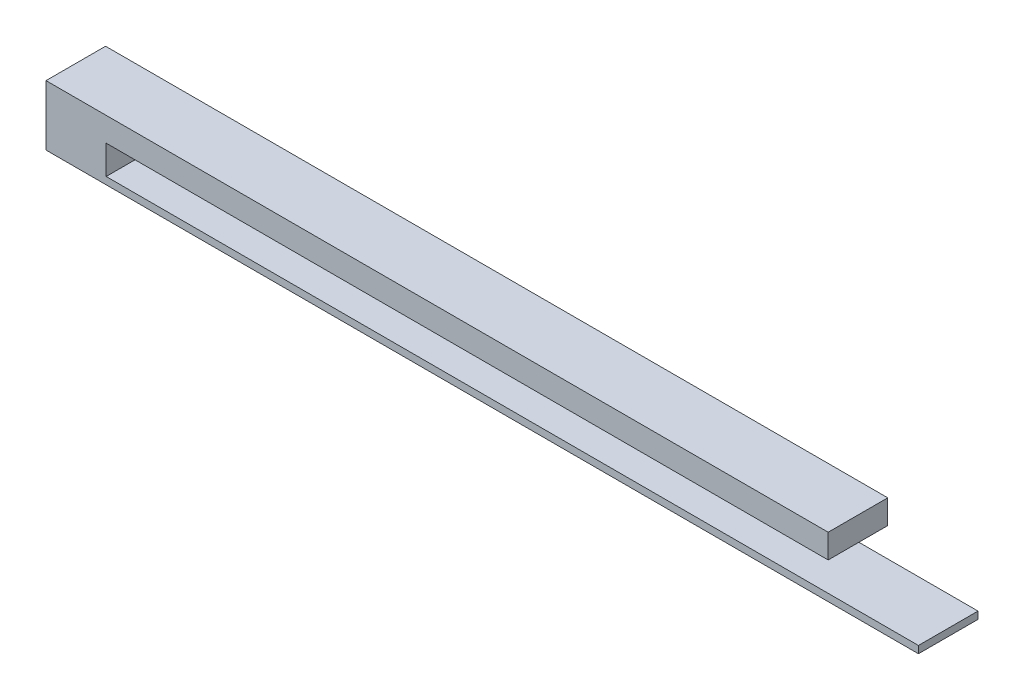
ISO-10303-21;
HEADER;
FILE_DESCRIPTION(('STEP AP214'),'2;1');
FILE_NAME('part.step','',(''),(''),'','','');
FILE_SCHEMA(('AUTOMOTIVE_DESIGN { 1 0 10303 214 1 1 1 1 }'));
ENDSEC;
DATA;
#1=APPLICATION_CONTEXT('core data for automotive mechanical design processes');
#2=APPLICATION_PROTOCOL_DEFINITION('international standard','automotive_design',2000,#1);
#3=PRODUCT_CONTEXT('',#1,'mechanical');
#4=PRODUCT('Part','Part','',(#3));
#5=PRODUCT_RELATED_PRODUCT_CATEGORY('part','',(#4));
#6=PRODUCT_DEFINITION_FORMATION('','',#4);
#7=PRODUCT_DEFINITION_CONTEXT('part definition',#1,'design');
#8=PRODUCT_DEFINITION('design','',#6,#7);
#9=PRODUCT_DEFINITION_SHAPE('','',#8);
#10=(LENGTH_UNIT() NAMED_UNIT(*) SI_UNIT(.MILLI.,.METRE.));
#11=(NAMED_UNIT(*) PLANE_ANGLE_UNIT() SI_UNIT($,.RADIAN.));
#12=(NAMED_UNIT(*) SI_UNIT($,.STERADIAN.) SOLID_ANGLE_UNIT());
#13=UNCERTAINTY_MEASURE_WITH_UNIT(LENGTH_MEASURE(1.E-05),#10,'distance_accuracy_value','');
#14=(GEOMETRIC_REPRESENTATION_CONTEXT(3) GLOBAL_UNCERTAINTY_ASSIGNED_CONTEXT((#13)) GLOBAL_UNIT_ASSIGNED_CONTEXT((#10,
#11,#12)) REPRESENTATION_CONTEXT('',''));
#15=CARTESIAN_POINT('',(0.,0.,0.));
#16=DIRECTION('',(0.,0.,1.));
#17=DIRECTION('',(1.,0.,0.));
#18=AXIS2_PLACEMENT_3D('',#15,#16,#17);
#19=CARTESIAN_POINT('',(-72.5,10.,-4.95));
#20=DIRECTION('',(0.,0.,1.));
#21=DIRECTION('',(1.,0.,0.));
#22=AXIS2_PLACEMENT_3D('',#19,#20,#21);
#23=PLANE('',#22);
#24=DIRECTION('',(0.,1.,0.));
#25=VECTOR('',#24,1.);
#26=CARTESIAN_POINT('',(57.5,10.,-4.95));
#27=LINE('',#26,#25);
#28=CARTESIAN_POINT('',(57.5,6.,-4.95));
#29=VERTEX_POINT('',#28);
#30=CARTESIAN_POINT('',(57.5,10.,-4.95));
#31=VERTEX_POINT('',#30);
#32=EDGE_CURVE('E102',#29,#31,#27,.T.);
#33=ORIENTED_EDGE('',*,*,#32,.F.);
#34=DIRECTION('',(-1.,0.,0.));
#35=VECTOR('',#34,1.);
#36=CARTESIAN_POINT('',(-72.5,6.,-4.95));
#37=LINE('',#36,#35);
#38=CARTESIAN_POINT('',(-62.5,6.,-4.95));
#39=VERTEX_POINT('',#38);
#40=EDGE_CURVE('E110',#29,#39,#37,.T.);
#41=ORIENTED_EDGE('',*,*,#40,.T.);
#42=DIRECTION('',(0.,1.,0.));
#43=VECTOR('',#42,1.);
#44=CARTESIAN_POINT('',(-62.5,10.,-4.95));
#45=LINE('',#44,#43);
#46=CARTESIAN_POINT('',(-62.5,1.2,-4.95));
#47=VERTEX_POINT('',#46);
#48=EDGE_CURVE('E117',#47,#39,#45,.T.);
#49=ORIENTED_EDGE('',*,*,#48,.F.);
#50=DIRECTION('',(1.,0.,0.));
#51=VECTOR('',#50,1.);
#52=CARTESIAN_POINT('',(-72.5,1.2,-4.95));
#53=LINE('',#52,#51);
#54=CARTESIAN_POINT('',(72.5,1.2,-4.95));
#55=VERTEX_POINT('',#54);
#56=EDGE_CURVE('E116',#47,#55,#53,.T.);
#57=ORIENTED_EDGE('',*,*,#56,.T.);
#58=DIRECTION('',(0.,-1.,0.));
#59=VECTOR('',#58,1.);
#60=CARTESIAN_POINT('',(72.5,10.,-4.95));
#61=LINE('',#60,#59);
#62=CARTESIAN_POINT('',(72.5,0.,-4.95));
#63=VERTEX_POINT('',#62);
#64=EDGE_CURVE('E148',#55,#63,#61,.T.);
#65=ORIENTED_EDGE('',*,*,#64,.T.);
#66=DIRECTION('',(-1.,0.,0.));
#67=VECTOR('',#66,1.);
#68=CARTESIAN_POINT('',(-72.5,0.,-4.95));
#69=LINE('',#68,#67);
#70=CARTESIAN_POINT('',(-72.5,0.,-4.95));
#71=VERTEX_POINT('',#70);
#72=EDGE_CURVE('E135',#63,#71,#69,.T.);
#73=ORIENTED_EDGE('',*,*,#72,.T.);
#74=DIRECTION('',(0.,-1.,0.));
#75=VECTOR('',#74,1.);
#76=CARTESIAN_POINT('',(-72.5,10.,-4.95));
#77=LINE('',#76,#75);
#78=CARTESIAN_POINT('',(-72.5,10.,-4.95));
#79=VERTEX_POINT('',#78);
#80=EDGE_CURVE('E145',#79,#71,#77,.T.);
#81=ORIENTED_EDGE('',*,*,#80,.F.);
#82=DIRECTION('',(-1.,0.,0.));
#83=VECTOR('',#82,1.);
#84=CARTESIAN_POINT('',(-72.5,10.,-4.95));
#85=LINE('',#84,#83);
#86=EDGE_CURVE('E112',#31,#79,#85,.T.);
#87=ORIENTED_EDGE('',*,*,#86,.F.);
#88=EDGE_LOOP('',(#33,#41,#49,#57,#65,#73,#81,#87));
#89=FACE_BOUND('',#88,.T.);
#90=ADVANCED_FACE('F38',(#89),#23,.F.);
#91=CARTESIAN_POINT('',(-72.5,10.,4.95));
#92=DIRECTION('',(0.,0.,-1.));
#93=DIRECTION('',(-1.,0.,0.));
#94=AXIS2_PLACEMENT_3D('',#91,#92,#93);
#95=PLANE('',#94);
#96=DIRECTION('',(0.,-1.,0.));
#97=VECTOR('',#96,1.);
#98=CARTESIAN_POINT('',(57.5,10.,4.95));
#99=LINE('',#98,#97);
#100=CARTESIAN_POINT('',(57.5,10.,4.95));
#101=VERTEX_POINT('',#100);
#102=CARTESIAN_POINT('',(57.5,6.,4.95));
#103=VERTEX_POINT('',#102);
#104=EDGE_CURVE('E52',#101,#103,#99,.T.);
#105=ORIENTED_EDGE('',*,*,#104,.F.);
#106=DIRECTION('',(1.,0.,0.));
#107=VECTOR('',#106,1.);
#108=CARTESIAN_POINT('',(-72.5,10.,4.95));
#109=LINE('',#108,#107);
#110=CARTESIAN_POINT('',(-72.5,10.,4.95));
#111=VERTEX_POINT('',#110);
#112=EDGE_CURVE('E129',#111,#101,#109,.T.);
#113=ORIENTED_EDGE('',*,*,#112,.F.);
#114=DIRECTION('',(0.,-1.,0.));
#115=VECTOR('',#114,1.);
#116=CARTESIAN_POINT('',(-72.5,10.,4.95));
#117=LINE('',#116,#115);
#118=CARTESIAN_POINT('',(-72.5,0.,4.95));
#119=VERTEX_POINT('',#118);
#120=EDGE_CURVE('E142',#111,#119,#117,.T.);
#121=ORIENTED_EDGE('',*,*,#120,.T.);
#122=DIRECTION('',(1.,0.,0.));
#123=VECTOR('',#122,1.);
#124=CARTESIAN_POINT('',(-72.5,0.,4.95));
#125=LINE('',#124,#123);
#126=CARTESIAN_POINT('',(72.5,0.,4.95));
#127=VERTEX_POINT('',#126);
#128=EDGE_CURVE('E127',#119,#127,#125,.T.);
#129=ORIENTED_EDGE('',*,*,#128,.T.);
#130=DIRECTION('',(0.,-1.,0.));
#131=VECTOR('',#130,1.);
#132=CARTESIAN_POINT('',(72.5,10.,4.95));
#133=LINE('',#132,#131);
#134=CARTESIAN_POINT('',(72.5,1.2,4.95));
#135=VERTEX_POINT('',#134);
#136=EDGE_CURVE('E132',#135,#127,#133,.T.);
#137=ORIENTED_EDGE('',*,*,#136,.F.);
#138=DIRECTION('',(-1.,0.,0.));
#139=VECTOR('',#138,1.);
#140=CARTESIAN_POINT('',(-72.5,1.2,4.95));
#141=LINE('',#140,#139);
#142=CARTESIAN_POINT('',(-62.5,1.2,4.95));
#143=VERTEX_POINT('',#142);
#144=EDGE_CURVE('E46',#135,#143,#141,.T.);
#145=ORIENTED_EDGE('',*,*,#144,.T.);
#146=DIRECTION('',(0.,-1.,0.));
#147=VECTOR('',#146,1.);
#148=CARTESIAN_POINT('',(-62.5,10.,4.95));
#149=LINE('',#148,#147);
#150=CARTESIAN_POINT('',(-62.5,6.,4.95));
#151=VERTEX_POINT('',#150);
#152=EDGE_CURVE('E150',#151,#143,#149,.T.);
#153=ORIENTED_EDGE('',*,*,#152,.F.);
#154=DIRECTION('',(1.,0.,0.));
#155=VECTOR('',#154,1.);
#156=CARTESIAN_POINT('',(-72.5,6.,4.95));
#157=LINE('',#156,#155);
#158=EDGE_CURVE('E152',#151,#103,#157,.T.);
#159=ORIENTED_EDGE('',*,*,#158,.T.);
#160=EDGE_LOOP('',(#105,#113,#121,#129,#137,#145,#153,#159));
#161=FACE_BOUND('',#160,.T.);
#162=ADVANCED_FACE('F157',(#161),#95,.F.);
#163=CARTESIAN_POINT('',(0.,10.,0.));
#164=DIRECTION('',(0.,1.,0.));
#165=DIRECTION('',(0.,0.,1.));
#166=AXIS2_PLACEMENT_3D('',#163,#164,#165);
#167=PLANE('',#166);
#168=ORIENTED_EDGE('',*,*,#112,.T.);
#169=DIRECTION('',(0.,0.,-1.));
#170=VECTOR('',#169,1.);
#171=CARTESIAN_POINT('',(57.5,10.,0.));
#172=LINE('',#171,#170);
#173=EDGE_CURVE('E113',#101,#31,#172,.T.);
#174=ORIENTED_EDGE('',*,*,#173,.T.);
#175=ORIENTED_EDGE('',*,*,#86,.T.);
#176=DIRECTION('',(0.,0.,1.));
#177=VECTOR('',#176,1.);
#178=CARTESIAN_POINT('',(-72.5,10.,-4.95));
#179=LINE('',#178,#177);
#180=EDGE_CURVE('E126',#79,#111,#179,.T.);
#181=ORIENTED_EDGE('',*,*,#180,.T.);
#182=EDGE_LOOP('',(#168,#174,#175,#181));
#183=FACE_BOUND('',#182,.T.);
#184=ADVANCED_FACE('F172',(#183),#167,.T.);
#185=CARTESIAN_POINT('',(-88.4170976861619,6.,7.58804979475656));
#186=DIRECTION('',(0.,1.,0.));
#187=DIRECTION('',(0.,0.,1.));
#188=AXIS2_PLACEMENT_3D('',#185,#186,#187);
#189=PLANE('',#188);
#190=DIRECTION('',(0.,0.,-1.));
#191=VECTOR('',#190,1.);
#192=CARTESIAN_POINT('',(57.5,6.,7.58804979475656));
#193=LINE('',#192,#191);
#194=EDGE_CURVE('E12',#103,#29,#193,.T.);
#195=ORIENTED_EDGE('',*,*,#194,.F.);
#196=ORIENTED_EDGE('',*,*,#158,.F.);
#197=DIRECTION('',(0.,0.,-1.));
#198=VECTOR('',#197,1.);
#199=CARTESIAN_POINT('',(-62.5,6.,7.58804979475656));
#200=LINE('',#199,#198);
#201=EDGE_CURVE('E60',#151,#39,#200,.T.);
#202=ORIENTED_EDGE('',*,*,#201,.T.);
#203=ORIENTED_EDGE('',*,*,#40,.F.);
#204=EDGE_LOOP('',(#195,#196,#202,#203));
#205=FACE_BOUND('',#204,.T.);
#206=ADVANCED_FACE('F115',(#205),#189,.F.);
#207=CARTESIAN_POINT('',(72.5,10.,-4.95));
#208=DIRECTION('',(-1.,0.,0.));
#209=DIRECTION('',(0.,0.,1.));
#210=AXIS2_PLACEMENT_3D('',#207,#208,#209);
#211=PLANE('',#210);
#212=ORIENTED_EDGE('',*,*,#64,.F.);
#213=DIRECTION('',(0.,0.,-1.));
#214=VECTOR('',#213,1.);
#215=CARTESIAN_POINT('',(72.5,1.2,7.58804979475656));
#216=LINE('',#215,#214);
#217=EDGE_CURVE('E162',#135,#55,#216,.T.);
#218=ORIENTED_EDGE('',*,*,#217,.F.);
#219=ORIENTED_EDGE('',*,*,#136,.T.);
#220=DIRECTION('',(0.,0.,-1.));
#221=VECTOR('',#220,1.);
#222=CARTESIAN_POINT('',(72.5,0.,-4.95));
#223=LINE('',#222,#221);
#224=EDGE_CURVE('E120',#127,#63,#223,.T.);
#225=ORIENTED_EDGE('',*,*,#224,.T.);
#226=EDGE_LOOP('',(#212,#218,#219,#225));
#227=FACE_BOUND('',#226,.T.);
#228=ADVANCED_FACE('F40',(#227),#211,.F.);
#229=CARTESIAN_POINT('',(-72.5,10.,-4.95));
#230=DIRECTION('',(1.,0.,0.));
#231=DIRECTION('',(0.,0.,-1.));
#232=AXIS2_PLACEMENT_3D('',#229,#230,#231);
#233=PLANE('',#232);
#234=DIRECTION('',(0.,0.,1.));
#235=VECTOR('',#234,1.);
#236=CARTESIAN_POINT('',(-72.5,0.,-4.95));
#237=LINE('',#236,#235);
#238=EDGE_CURVE('E137',#71,#119,#237,.T.);
#239=ORIENTED_EDGE('',*,*,#238,.T.);
#240=ORIENTED_EDGE('',*,*,#120,.F.);
#241=ORIENTED_EDGE('',*,*,#180,.F.);
#242=ORIENTED_EDGE('',*,*,#80,.T.);
#243=EDGE_LOOP('',(#239,#240,#241,#242));
#244=FACE_BOUND('',#243,.T.);
#245=ADVANCED_FACE('F183',(#244),#233,.F.);
#246=CARTESIAN_POINT('',(0.,0.,0.));
#247=DIRECTION('',(0.,1.,0.));
#248=DIRECTION('',(0.,0.,1.));
#249=AXIS2_PLACEMENT_3D('',#246,#247,#248);
#250=PLANE('',#249);
#251=ORIENTED_EDGE('',*,*,#224,.F.);
#252=ORIENTED_EDGE('',*,*,#128,.F.);
#253=ORIENTED_EDGE('',*,*,#238,.F.);
#254=ORIENTED_EDGE('',*,*,#72,.F.);
#255=EDGE_LOOP('',(#251,#252,#253,#254));
#256=FACE_BOUND('',#255,.T.);
#257=ADVANCED_FACE('F181',(#256),#250,.F.);
#258=CARTESIAN_POINT('',(-88.4170976861619,1.2,7.58804979475656));
#259=DIRECTION('',(0.,-1.,0.));
#260=DIRECTION('',(0.,0.,-1.));
#261=AXIS2_PLACEMENT_3D('',#258,#259,#260);
#262=PLANE('',#261);
#263=DIRECTION('',(0.,0.,1.));
#264=VECTOR('',#263,1.);
#265=CARTESIAN_POINT('',(-62.5,1.2,7.58804979475656));
#266=LINE('',#265,#264);
#267=EDGE_CURVE('E164',#47,#143,#266,.T.);
#268=ORIENTED_EDGE('',*,*,#267,.T.);
#269=ORIENTED_EDGE('',*,*,#144,.F.);
#270=ORIENTED_EDGE('',*,*,#217,.T.);
#271=ORIENTED_EDGE('',*,*,#56,.F.);
#272=EDGE_LOOP('',(#268,#269,#270,#271));
#273=FACE_BOUND('',#272,.T.);
#274=ADVANCED_FACE('F161',(#273),#262,.F.);
#275=CARTESIAN_POINT('',(-62.5,10.,-4.95));
#276=DIRECTION('',(1.,0.,0.));
#277=DIRECTION('',(0.,0.,-1.));
#278=AXIS2_PLACEMENT_3D('',#275,#276,#277);
#279=PLANE('',#278);
#280=ORIENTED_EDGE('',*,*,#48,.T.);
#281=ORIENTED_EDGE('',*,*,#201,.F.);
#282=ORIENTED_EDGE('',*,*,#152,.T.);
#283=ORIENTED_EDGE('',*,*,#267,.F.);
#284=EDGE_LOOP('',(#280,#281,#282,#283));
#285=FACE_BOUND('',#284,.T.);
#286=ADVANCED_FACE('F205',(#285),#279,.T.);
#287=CARTESIAN_POINT('',(57.5,0.,0.));
#288=DIRECTION('',(1.,0.,0.));
#289=DIRECTION('',(0.,0.,-1.));
#290=AXIS2_PLACEMENT_3D('',#287,#288,#289);
#291=PLANE('',#290);
#292=ORIENTED_EDGE('',*,*,#104,.T.);
#293=ORIENTED_EDGE('',*,*,#194,.T.);
#294=ORIENTED_EDGE('',*,*,#32,.T.);
#295=ORIENTED_EDGE('',*,*,#173,.F.);
#296=EDGE_LOOP('',(#292,#293,#294,#295));
#297=FACE_BOUND('',#296,.T.);
#298=ADVANCED_FACE('F101',(#297),#291,.T.);
#299=CLOSED_SHELL('',(#90,#162,#184,#206,#228,#245,#257,#274,#286,#298));
#300=MANIFOLD_SOLID_BREP('B2',#299);
#301=ADVANCED_BREP_SHAPE_REPRESENTATION('',(#18,#300),#14);
#302=SHAPE_DEFINITION_REPRESENTATION(#9,#301);
ENDSEC;
END-ISO-10303-21;
